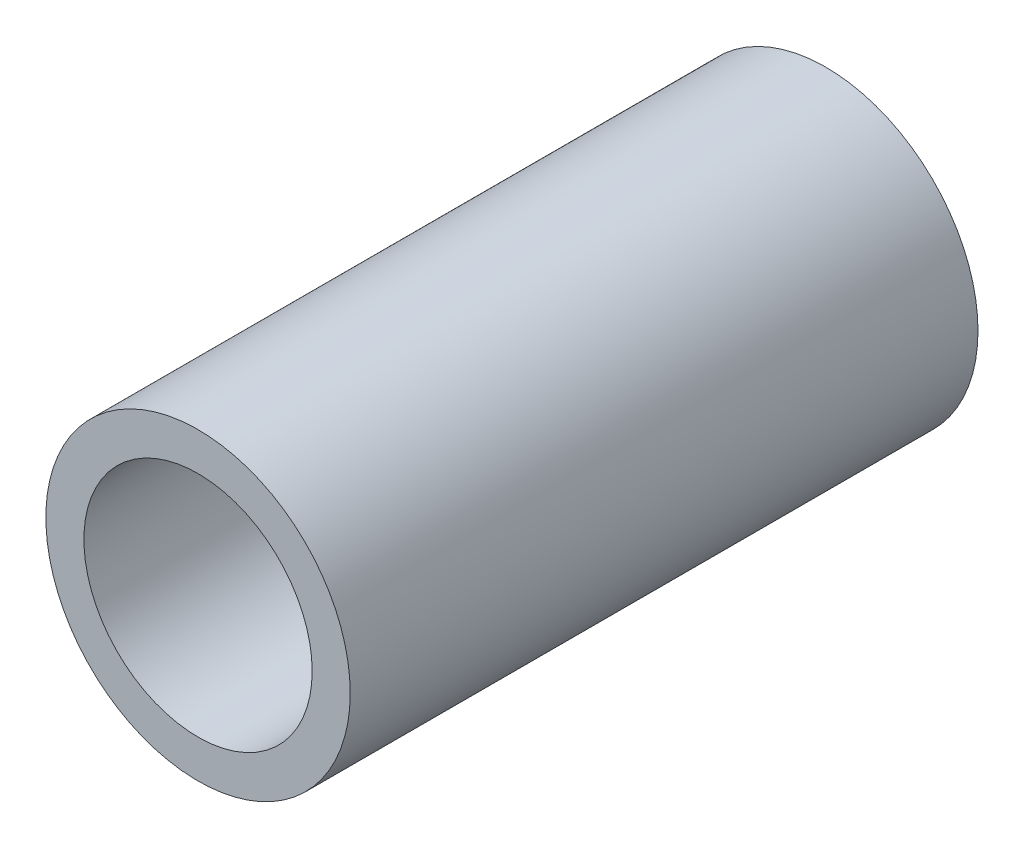
ISO-10303-21;
HEADER;
FILE_DESCRIPTION(('STEP AP214'),'2;1');
FILE_NAME('part.step','',(''),(''),'','','');
FILE_SCHEMA(('AUTOMOTIVE_DESIGN { 1 0 10303 214 1 1 1 1 }'));
ENDSEC;
DATA;
#1=APPLICATION_CONTEXT('core data for automotive mechanical design processes');
#2=APPLICATION_PROTOCOL_DEFINITION('international standard','automotive_design',2000,#1);
#3=PRODUCT_CONTEXT('',#1,'mechanical');
#4=PRODUCT('Part','Part','',(#3));
#5=PRODUCT_RELATED_PRODUCT_CATEGORY('part','',(#4));
#6=PRODUCT_DEFINITION_FORMATION('','',#4);
#7=PRODUCT_DEFINITION_CONTEXT('part definition',#1,'design');
#8=PRODUCT_DEFINITION('design','',#6,#7);
#9=PRODUCT_DEFINITION_SHAPE('','',#8);
#10=(LENGTH_UNIT() NAMED_UNIT(*) SI_UNIT(.MILLI.,.METRE.));
#11=(NAMED_UNIT(*) PLANE_ANGLE_UNIT() SI_UNIT($,.RADIAN.));
#12=(NAMED_UNIT(*) SI_UNIT($,.STERADIAN.) SOLID_ANGLE_UNIT());
#13=UNCERTAINTY_MEASURE_WITH_UNIT(LENGTH_MEASURE(1.E-05),#10,'distance_accuracy_value','');
#14=(GEOMETRIC_REPRESENTATION_CONTEXT(3) GLOBAL_UNCERTAINTY_ASSIGNED_CONTEXT((#13)) GLOBAL_UNIT_ASSIGNED_CONTEXT((#10,
#11,#12)) REPRESENTATION_CONTEXT('',''));
#15=CARTESIAN_POINT('',(0.,0.,0.));
#16=DIRECTION('',(0.,0.,1.));
#17=DIRECTION('',(1.,0.,0.));
#18=AXIS2_PLACEMENT_3D('',#15,#16,#17);
#19=CARTESIAN_POINT('',(0.,0.,16.5));
#20=DIRECTION('',(0.,0.,1.));
#21=DIRECTION('',(1.,0.,0.));
#22=AXIS2_PLACEMENT_3D('',#19,#20,#21);
#23=PLANE('',#22);
#24=CARTESIAN_POINT('',(0.,0.,16.5));
#25=DIRECTION('',(0.,0.,1.));
#26=DIRECTION('',(1.,0.,0.));
#27=AXIS2_PLACEMENT_3D('',#24,#25,#26);
#28=CIRCLE('',#27,4.);
#29=CARTESIAN_POINT('',(4.,0.,16.5));
#30=VERTEX_POINT('',#29);
#31=EDGE_CURVE('E10',#30,#30,#28,.T.);
#32=ORIENTED_EDGE('',*,*,#31,.T.);
#33=EDGE_LOOP('',(#32));
#34=FACE_BOUND('',#33,.T.);
#35=CARTESIAN_POINT('',(0.,0.,16.5));
#36=DIRECTION('',(0.,0.,1.));
#37=DIRECTION('',(1.,0.,0.));
#38=AXIS2_PLACEMENT_3D('',#35,#36,#37);
#39=CIRCLE('',#38,3.);
#40=CARTESIAN_POINT('',(3.,0.,16.5));
#41=VERTEX_POINT('',#40);
#42=EDGE_CURVE('E50',#41,#41,#39,.T.);
#43=ORIENTED_EDGE('',*,*,#42,.F.);
#44=EDGE_LOOP('',(#43));
#45=FACE_BOUND('',#44,.T.);
#46=ADVANCED_FACE('F39',(#34,#45),#23,.T.);
#47=CARTESIAN_POINT('',(0.,0.,0.));
#48=DIRECTION('',(0.,0.,1.));
#49=DIRECTION('',(1.,0.,0.));
#50=AXIS2_PLACEMENT_3D('',#47,#48,#49);
#51=PLANE('',#50);
#52=CARTESIAN_POINT('',(0.,0.,0.));
#53=DIRECTION('',(0.,0.,1.));
#54=DIRECTION('',(1.,0.,0.));
#55=AXIS2_PLACEMENT_3D('',#52,#53,#54);
#56=CIRCLE('',#55,4.);
#57=CARTESIAN_POINT('',(4.,0.,0.));
#58=VERTEX_POINT('',#57);
#59=EDGE_CURVE('E43',#58,#58,#56,.T.);
#60=ORIENTED_EDGE('',*,*,#59,.F.);
#61=EDGE_LOOP('',(#60));
#62=FACE_BOUND('',#61,.T.);
#63=CARTESIAN_POINT('',(0.,0.,0.));
#64=DIRECTION('',(0.,0.,1.));
#65=DIRECTION('',(1.,0.,0.));
#66=AXIS2_PLACEMENT_3D('',#63,#64,#65);
#67=CIRCLE('',#66,3.);
#68=CARTESIAN_POINT('',(3.,0.,0.));
#69=VERTEX_POINT('',#68);
#70=EDGE_CURVE('E52',#69,#69,#67,.T.);
#71=ORIENTED_EDGE('',*,*,#70,.T.);
#72=EDGE_LOOP('',(#71));
#73=FACE_BOUND('',#72,.T.);
#74=ADVANCED_FACE('F62',(#62,#73),#51,.F.);
#75=CARTESIAN_POINT('',(0.,0.,16.5));
#76=DIRECTION('',(0.,0.,-1.));
#77=DIRECTION('',(-1.,0.,0.));
#78=AXIS2_PLACEMENT_3D('',#75,#76,#77);
#79=CYLINDRICAL_SURFACE('',#78,4.);
#80=ORIENTED_EDGE('',*,*,#31,.F.);
#81=EDGE_LOOP('',(#80));
#82=FACE_BOUND('',#81,.T.);
#83=ORIENTED_EDGE('',*,*,#59,.T.);
#84=EDGE_LOOP('',(#83));
#85=FACE_BOUND('',#84,.T.);
#86=ADVANCED_FACE('F41',(#82,#85),#79,.T.);
#87=CARTESIAN_POINT('',(0.,0.,16.5));
#88=DIRECTION('',(0.,0.,-1.));
#89=DIRECTION('',(-1.,0.,0.));
#90=AXIS2_PLACEMENT_3D('',#87,#88,#89);
#91=CYLINDRICAL_SURFACE('',#90,3.);
#92=ORIENTED_EDGE('',*,*,#42,.T.);
#93=EDGE_LOOP('',(#92));
#94=FACE_BOUND('',#93,.T.);
#95=ORIENTED_EDGE('',*,*,#70,.F.);
#96=EDGE_LOOP('',(#95));
#97=FACE_BOUND('',#96,.T.);
#98=ADVANCED_FACE('F58',(#94,#97),#91,.F.);
#99=CLOSED_SHELL('',(#46,#74,#86,#98));
#100=MANIFOLD_SOLID_BREP('B2',#99);
#101=ADVANCED_BREP_SHAPE_REPRESENTATION('',(#18,#100),#14);
#102=SHAPE_DEFINITION_REPRESENTATION(#9,#101);
ENDSEC;
END-ISO-10303-21;
